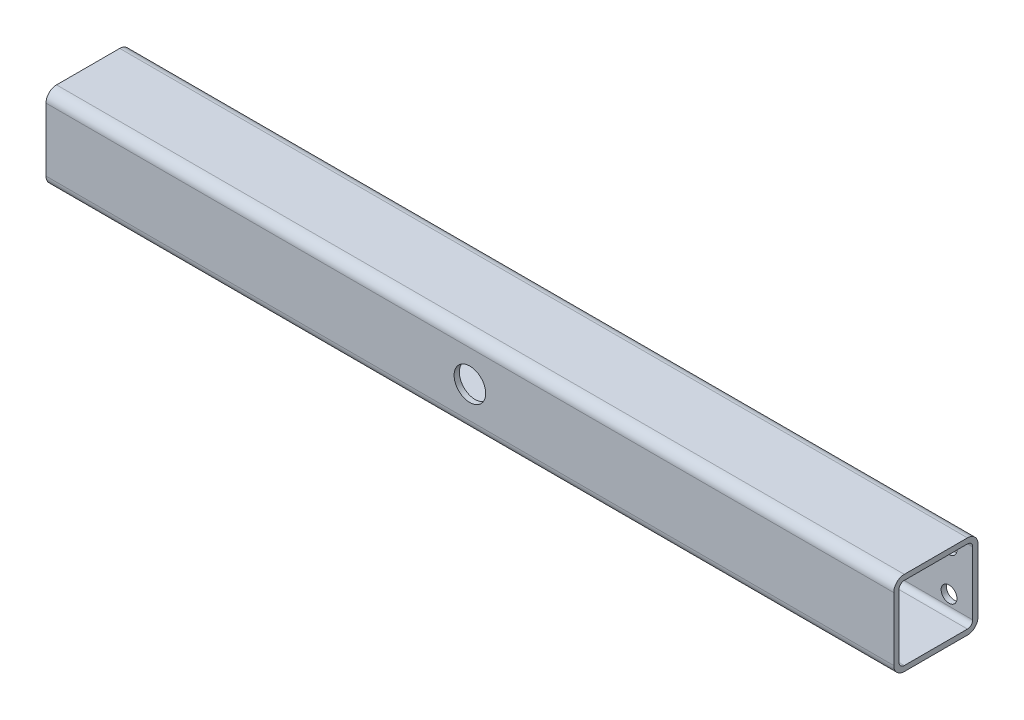
ISO-10303-21;
HEADER;
FILE_DESCRIPTION(('STEP AP214'),'2;1');
FILE_NAME('part.step','',(''),(''),'','','');
FILE_SCHEMA(('AUTOMOTIVE_DESIGN { 1 0 10303 214 1 1 1 1 }'));
ENDSEC;
DATA;
#1=APPLICATION_CONTEXT('core data for automotive mechanical design processes');
#2=APPLICATION_PROTOCOL_DEFINITION('international standard','automotive_design',2000,#1);
#3=PRODUCT_CONTEXT('',#1,'mechanical');
#4=PRODUCT('Part','Part','',(#3));
#5=PRODUCT_RELATED_PRODUCT_CATEGORY('part','',(#4));
#6=PRODUCT_DEFINITION_FORMATION('','',#4);
#7=PRODUCT_DEFINITION_CONTEXT('part definition',#1,'design');
#8=PRODUCT_DEFINITION('design','',#6,#7);
#9=PRODUCT_DEFINITION_SHAPE('','',#8);
#10=(LENGTH_UNIT() NAMED_UNIT(*) SI_UNIT(.MILLI.,.METRE.));
#11=(NAMED_UNIT(*) PLANE_ANGLE_UNIT() SI_UNIT($,.RADIAN.));
#12=(NAMED_UNIT(*) SI_UNIT($,.STERADIAN.) SOLID_ANGLE_UNIT());
#13=UNCERTAINTY_MEASURE_WITH_UNIT(LENGTH_MEASURE(1.E-05),#10,'distance_accuracy_value','');
#14=(GEOMETRIC_REPRESENTATION_CONTEXT(3) GLOBAL_UNCERTAINTY_ASSIGNED_CONTEXT((#13)) GLOBAL_UNIT_ASSIGNED_CONTEXT((#10,
#11,#12)) REPRESENTATION_CONTEXT('',''));
#15=CARTESIAN_POINT('',(0.,0.,0.));
#16=DIRECTION('',(0.,0.,1.));
#17=DIRECTION('',(1.,0.,0.));
#18=AXIS2_PLACEMENT_3D('',#15,#16,#17);
#19=CARTESIAN_POINT('',(511.175,38.1,127.));
#20=DIRECTION('',(0.,1.,0.));
#21=DIRECTION('',(0.,0.,1.));
#22=AXIS2_PLACEMENT_3D('',#19,#20,#21);
#23=PLANE('',#22);
#24=DIRECTION('',(0.,0.,-1.));
#25=VECTOR('',#24,1.);
#26=CARTESIAN_POINT('',(-511.175,38.1,127.));
#27=LINE('',#26,#25);
#28=CARTESIAN_POINT('',(-511.175,38.1,127.));
#29=VERTEX_POINT('',#28);
#30=CARTESIAN_POINT('',(-511.175,38.1,50.8));
#31=VERTEX_POINT('',#30);
#32=EDGE_CURVE('E235',#29,#31,#27,.T.);
#33=ORIENTED_EDGE('',*,*,#32,.T.);
#34=DIRECTION('',(-1.,0.,0.));
#35=VECTOR('',#34,1.);
#36=CARTESIAN_POINT('',(511.175,38.1,50.8));
#37=LINE('',#36,#35);
#38=CARTESIAN_POINT('',(511.175,38.1,50.8));
#39=VERTEX_POINT('',#38);
#40=EDGE_CURVE('E254',#39,#31,#37,.T.);
#41=ORIENTED_EDGE('',*,*,#40,.F.);
#42=DIRECTION('',(0.,0.,-1.));
#43=VECTOR('',#42,1.);
#44=CARTESIAN_POINT('',(511.175,38.1,127.));
#45=LINE('',#44,#43);
#46=CARTESIAN_POINT('',(511.175,38.1,127.));
#47=VERTEX_POINT('',#46);
#48=EDGE_CURVE('E252',#47,#39,#45,.T.);
#49=ORIENTED_EDGE('',*,*,#48,.F.);
#50=DIRECTION('',(-1.,0.,0.));
#51=VECTOR('',#50,1.);
#52=CARTESIAN_POINT('',(511.175,38.1,127.));
#53=LINE('',#52,#51);
#54=EDGE_CURVE('E257',#47,#29,#53,.T.);
#55=ORIENTED_EDGE('',*,*,#54,.T.);
#56=EDGE_LOOP('',(#33,#41,#49,#55));
#57=FACE_BOUND('',#56,.T.);
#58=CARTESIAN_POINT('',(482.6,38.1,120.65));
#59=DIRECTION('',(0.,-1.,0.));
#60=DIRECTION('',(0.,0.,-1.));
#61=AXIS2_PLACEMENT_3D('',#58,#59,#60);
#62=CIRCLE('',#61,3.97510000000003);
#63=CARTESIAN_POINT('',(482.6,38.1,116.6749));
#64=VERTEX_POINT('',#63);
#65=EDGE_CURVE('E285',#64,#64,#62,.T.);
#66=ORIENTED_EDGE('',*,*,#65,.F.);
#67=EDGE_LOOP('',(#66));
#68=FACE_BOUND('',#67,.T.);
#69=CARTESIAN_POINT('',(-482.6,38.1,120.65));
#70=DIRECTION('',(0.,1.,0.));
#71=DIRECTION('',(0.,0.,-1.));
#72=AXIS2_PLACEMENT_3D('',#69,#70,#71);
#73=CIRCLE('',#72,3.97510000000003);
#74=CARTESIAN_POINT('',(-482.6,38.1,116.6749));
#75=VERTEX_POINT('',#74);
#76=EDGE_CURVE('E301',#75,#75,#73,.T.);
#77=ORIENTED_EDGE('',*,*,#76,.T.);
#78=EDGE_LOOP('',(#77));
#79=FACE_BOUND('',#78,.T.);
#80=ADVANCED_FACE('F36',(#57,#68,#79),#23,.F.);
#81=CARTESIAN_POINT('',(511.175,44.45,127.));
#82=DIRECTION('',(0.,1.,0.));
#83=DIRECTION('',(0.,0.,1.));
#84=AXIS2_PLACEMENT_3D('',#81,#82,#83);
#85=PLANE('',#84);
#86=DIRECTION('',(0.,0.,-1.));
#87=VECTOR('',#86,1.);
#88=CARTESIAN_POINT('',(-511.175,44.45,127.));
#89=LINE('',#88,#87);
#90=CARTESIAN_POINT('',(-511.175,44.45,127.));
#91=VERTEX_POINT('',#90);
#92=CARTESIAN_POINT('',(-511.175,44.45,50.8));
#93=VERTEX_POINT('',#92);
#94=EDGE_CURVE('E182',#91,#93,#89,.T.);
#95=ORIENTED_EDGE('',*,*,#94,.F.);
#96=DIRECTION('',(-1.,0.,0.));
#97=VECTOR('',#96,1.);
#98=CARTESIAN_POINT('',(511.175,44.45,127.));
#99=LINE('',#98,#97);
#100=CARTESIAN_POINT('',(511.175,44.45,127.));
#101=VERTEX_POINT('',#100);
#102=EDGE_CURVE('E218',#101,#91,#99,.T.);
#103=ORIENTED_EDGE('',*,*,#102,.F.);
#104=DIRECTION('',(0.,0.,-1.));
#105=VECTOR('',#104,1.);
#106=CARTESIAN_POINT('',(511.175,44.45,127.));
#107=LINE('',#106,#105);
#108=CARTESIAN_POINT('',(511.175,44.45,50.8));
#109=VERTEX_POINT('',#108);
#110=EDGE_CURVE('E199',#101,#109,#107,.T.);
#111=ORIENTED_EDGE('',*,*,#110,.T.);
#112=DIRECTION('',(-1.,0.,0.));
#113=VECTOR('',#112,1.);
#114=CARTESIAN_POINT('',(511.175,44.45,50.8));
#115=LINE('',#114,#113);
#116=EDGE_CURVE('E216',#109,#93,#115,.T.);
#117=ORIENTED_EDGE('',*,*,#116,.T.);
#118=EDGE_LOOP('',(#95,#103,#111,#117));
#119=FACE_BOUND('',#118,.T.);
#120=CARTESIAN_POINT('',(482.6,44.45,120.65));
#121=DIRECTION('',(0.,1.,0.));
#122=DIRECTION('',(0.,0.,1.));
#123=AXIS2_PLACEMENT_3D('',#120,#121,#122);
#124=CIRCLE('',#123,3.97510000000003);
#125=CARTESIAN_POINT('',(482.6,44.45,124.6251));
#126=VERTEX_POINT('',#125);
#127=EDGE_CURVE('E282',#126,#126,#124,.T.);
#128=ORIENTED_EDGE('',*,*,#127,.F.);
#129=EDGE_LOOP('',(#128));
#130=FACE_BOUND('',#129,.T.);
#131=CARTESIAN_POINT('',(-482.6,44.45,120.65));
#132=DIRECTION('',(0.,1.,0.));
#133=DIRECTION('',(0.,0.,1.));
#134=AXIS2_PLACEMENT_3D('',#131,#132,#133);
#135=CIRCLE('',#134,3.97510000000003);
#136=CARTESIAN_POINT('',(-482.6,44.45,124.6251));
#137=VERTEX_POINT('',#136);
#138=EDGE_CURVE('E40',#137,#137,#135,.F.);
#139=ORIENTED_EDGE('',*,*,#138,.T.);
#140=EDGE_LOOP('',(#139));
#141=FACE_BOUND('',#140,.T.);
#142=ADVANCED_FACE('F316',(#119,#130,#141),#85,.T.);
#143=CARTESIAN_POINT('',(511.175,127.,38.1));
#144=DIRECTION('',(0.,0.,1.));
#145=DIRECTION('',(0.,-1.,0.));
#146=AXIS2_PLACEMENT_3D('',#143,#144,#145);
#147=PLANE('',#146);
#148=CARTESIAN_POINT('',(-482.6,63.5,38.1));
#149=DIRECTION('',(0.,0.,1.));
#150=DIRECTION('',(0.,1.,0.));
#151=AXIS2_PLACEMENT_3D('',#148,#149,#150);
#152=CIRCLE('',#151,9.52500000000002);
#153=CARTESIAN_POINT('',(-482.6,73.025,38.1));
#154=VERTEX_POINT('',#153);
#155=EDGE_CURVE('E288',#154,#154,#152,.T.);
#156=ORIENTED_EDGE('',*,*,#155,.T.);
#157=EDGE_LOOP('',(#156));
#158=FACE_BOUND('',#157,.T.);
#159=CARTESIAN_POINT('',(482.6,114.3,38.1));
#160=DIRECTION('',(0.,0.,-1.));
#161=DIRECTION('',(0.,1.,0.));
#162=AXIS2_PLACEMENT_3D('',#159,#160,#161);
#163=CIRCLE('',#162,9.52500000000002);
#164=CARTESIAN_POINT('',(482.6,123.825,38.1));
#165=VERTEX_POINT('',#164);
#166=EDGE_CURVE('E281',#165,#165,#163,.T.);
#167=ORIENTED_EDGE('',*,*,#166,.F.);
#168=EDGE_LOOP('',(#167));
#169=FACE_BOUND('',#168,.T.);
#170=CARTESIAN_POINT('',(482.6,63.5,38.1));
#171=DIRECTION('',(0.,0.,-1.));
#172=DIRECTION('',(0.,1.,0.));
#173=AXIS2_PLACEMENT_3D('',#170,#171,#172);
#174=CIRCLE('',#173,9.52500000000002);
#175=CARTESIAN_POINT('',(482.6,73.025,38.1));
#176=VERTEX_POINT('',#175);
#177=EDGE_CURVE('E277',#176,#176,#174,.T.);
#178=ORIENTED_EDGE('',*,*,#177,.F.);
#179=EDGE_LOOP('',(#178));
#180=FACE_BOUND('',#179,.T.);
#181=DIRECTION('',(0.,1.,0.));
#182=VECTOR('',#181,1.);
#183=CARTESIAN_POINT('',(-511.175,127.,38.1));
#184=LINE('',#183,#182);
#185=CARTESIAN_POINT('',(-511.175,50.8,38.1));
#186=VERTEX_POINT('',#185);
#187=CARTESIAN_POINT('',(-511.175,127.,38.1));
#188=VERTEX_POINT('',#187);
#189=EDGE_CURVE('E223',#186,#188,#184,.T.);
#190=ORIENTED_EDGE('',*,*,#189,.T.);
#191=DIRECTION('',(-1.,0.,0.));
#192=VECTOR('',#191,1.);
#193=CARTESIAN_POINT('',(511.175,127.,38.1));
#194=LINE('',#193,#192);
#195=CARTESIAN_POINT('',(511.175,127.,38.1));
#196=VERTEX_POINT('',#195);
#197=EDGE_CURVE('E45',#196,#188,#194,.T.);
#198=ORIENTED_EDGE('',*,*,#197,.F.);
#199=DIRECTION('',(0.,1.,0.));
#200=VECTOR('',#199,1.);
#201=CARTESIAN_POINT('',(511.175,127.,38.1));
#202=LINE('',#201,#200);
#203=CARTESIAN_POINT('',(511.175,50.8,38.1));
#204=VERTEX_POINT('',#203);
#205=EDGE_CURVE('E240',#204,#196,#202,.T.);
#206=ORIENTED_EDGE('',*,*,#205,.F.);
#207=DIRECTION('',(-1.,0.,0.));
#208=VECTOR('',#207,1.);
#209=CARTESIAN_POINT('',(511.175,50.8,38.1));
#210=LINE('',#209,#208);
#211=EDGE_CURVE('E11',#204,#186,#210,.T.);
#212=ORIENTED_EDGE('',*,*,#211,.T.);
#213=EDGE_LOOP('',(#190,#198,#206,#212));
#214=FACE_BOUND('',#213,.T.);
#215=CARTESIAN_POINT('',(-482.6,114.3,38.1));
#216=DIRECTION('',(0.,0.,1.));
#217=DIRECTION('',(0.,1.,0.));
#218=AXIS2_PLACEMENT_3D('',#215,#216,#217);
#219=CIRCLE('',#218,9.52500000000002);
#220=CARTESIAN_POINT('',(-482.6,123.825,38.1));
#221=VERTEX_POINT('',#220);
#222=EDGE_CURVE('E291',#221,#221,#219,.T.);
#223=ORIENTED_EDGE('',*,*,#222,.T.);
#224=EDGE_LOOP('',(#223));
#225=FACE_BOUND('',#224,.T.);
#226=ADVANCED_FACE('F312',(#158,#169,#180,#214,#225),#147,.F.);
#227=CARTESIAN_POINT('',(511.175,127.,44.45));
#228=DIRECTION('',(0.,0.,1.));
#229=DIRECTION('',(0.,-1.,0.));
#230=AXIS2_PLACEMENT_3D('',#227,#228,#229);
#231=PLANE('',#230);
#232=CARTESIAN_POINT('',(-482.6,63.5,44.45));
#233=DIRECTION('',(0.,0.,1.));
#234=DIRECTION('',(0.,-1.,0.));
#235=AXIS2_PLACEMENT_3D('',#232,#233,#234);
#236=CIRCLE('',#235,9.52500000000002);
#237=CARTESIAN_POINT('',(-482.6,53.975,44.45));
#238=VERTEX_POINT('',#237);
#239=EDGE_CURVE('E286',#238,#238,#236,.F.);
#240=ORIENTED_EDGE('',*,*,#239,.T.);
#241=EDGE_LOOP('',(#240));
#242=FACE_BOUND('',#241,.T.);
#243=CARTESIAN_POINT('',(482.6,114.3,44.45));
#244=DIRECTION('',(0.,0.,1.));
#245=DIRECTION('',(0.,-1.,0.));
#246=AXIS2_PLACEMENT_3D('',#243,#244,#245);
#247=CIRCLE('',#246,9.52500000000002);
#248=CARTESIAN_POINT('',(482.6,104.775,44.45));
#249=VERTEX_POINT('',#248);
#250=EDGE_CURVE('E278',#249,#249,#247,.T.);
#251=ORIENTED_EDGE('',*,*,#250,.F.);
#252=EDGE_LOOP('',(#251));
#253=FACE_BOUND('',#252,.T.);
#254=CARTESIAN_POINT('',(482.6,63.5,44.45));
#255=DIRECTION('',(0.,0.,1.));
#256=DIRECTION('',(0.,-1.,0.));
#257=AXIS2_PLACEMENT_3D('',#254,#255,#256);
#258=CIRCLE('',#257,9.52500000000002);
#259=CARTESIAN_POINT('',(482.6,53.975,44.45));
#260=VERTEX_POINT('',#259);
#261=EDGE_CURVE('E274',#260,#260,#258,.T.);
#262=ORIENTED_EDGE('',*,*,#261,.F.);
#263=EDGE_LOOP('',(#262));
#264=FACE_BOUND('',#263,.T.);
#265=DIRECTION('',(0.,1.,0.));
#266=VECTOR('',#265,1.);
#267=CARTESIAN_POINT('',(-511.175,127.,44.45));
#268=LINE('',#267,#266);
#269=CARTESIAN_POINT('',(-511.175,50.8,44.45));
#270=VERTEX_POINT('',#269);
#271=CARTESIAN_POINT('',(-511.175,127.,44.45));
#272=VERTEX_POINT('',#271);
#273=EDGE_CURVE('E188',#270,#272,#268,.T.);
#274=ORIENTED_EDGE('',*,*,#273,.F.);
#275=DIRECTION('',(-1.,0.,0.));
#276=VECTOR('',#275,1.);
#277=CARTESIAN_POINT('',(511.175,50.8,44.45));
#278=LINE('',#277,#276);
#279=CARTESIAN_POINT('',(511.175,50.8,44.45));
#280=VERTEX_POINT('',#279);
#281=EDGE_CURVE('E214',#280,#270,#278,.T.);
#282=ORIENTED_EDGE('',*,*,#281,.F.);
#283=DIRECTION('',(0.,1.,0.));
#284=VECTOR('',#283,1.);
#285=CARTESIAN_POINT('',(511.175,127.,44.45));
#286=LINE('',#285,#284);
#287=CARTESIAN_POINT('',(511.175,127.,44.45));
#288=VERTEX_POINT('',#287);
#289=EDGE_CURVE('E203',#280,#288,#286,.T.);
#290=ORIENTED_EDGE('',*,*,#289,.T.);
#291=DIRECTION('',(-1.,0.,0.));
#292=VECTOR('',#291,1.);
#293=CARTESIAN_POINT('',(511.175,127.,44.45));
#294=LINE('',#293,#292);
#295=EDGE_CURVE('E212',#288,#272,#294,.T.);
#296=ORIENTED_EDGE('',*,*,#295,.T.);
#297=EDGE_LOOP('',(#274,#282,#290,#296));
#298=FACE_BOUND('',#297,.T.);
#299=CARTESIAN_POINT('',(-482.6,114.3,44.45));
#300=DIRECTION('',(0.,0.,1.));
#301=DIRECTION('',(0.,-1.,0.));
#302=AXIS2_PLACEMENT_3D('',#299,#300,#301);
#303=CIRCLE('',#302,9.52500000000002);
#304=CARTESIAN_POINT('',(-482.6,104.775,44.45));
#305=VERTEX_POINT('',#304);
#306=EDGE_CURVE('E289',#305,#305,#303,.F.);
#307=ORIENTED_EDGE('',*,*,#306,.T.);
#308=EDGE_LOOP('',(#307));
#309=FACE_BOUND('',#308,.T.);
#310=ADVANCED_FACE('F315',(#242,#253,#264,#298,#309),#231,.T.);
#311=CARTESIAN_POINT('',(511.175,50.8,50.8));
#312=DIRECTION('',(-1.,0.,0.));
#313=DIRECTION('',(0.,0.,1.));
#314=AXIS2_PLACEMENT_3D('',#311,#312,#313);
#315=PLANE('',#314);
#316=CARTESIAN_POINT('',(511.175,50.8,50.8));
#317=DIRECTION('',(1.,0.,0.));
#318=DIRECTION('',(0.,0.,1.));
#319=AXIS2_PLACEMENT_3D('',#316,#317,#318);
#320=CIRCLE('',#319,12.7);
#321=EDGE_CURVE('E237',#39,#204,#320,.T.);
#322=ORIENTED_EDGE('',*,*,#321,.T.);
#323=ORIENTED_EDGE('',*,*,#205,.T.);
#324=CARTESIAN_POINT('',(511.175,127.,50.8));
#325=DIRECTION('',(1.,0.,0.));
#326=DIRECTION('',(0.,0.,-1.));
#327=AXIS2_PLACEMENT_3D('',#324,#325,#326);
#328=CIRCLE('',#327,12.7);
#329=CARTESIAN_POINT('',(511.175,139.7,50.8));
#330=VERTEX_POINT('',#329);
#331=EDGE_CURVE('E242',#196,#330,#328,.T.);
#332=ORIENTED_EDGE('',*,*,#331,.T.);
#333=DIRECTION('',(0.,0.,1.));
#334=VECTOR('',#333,1.);
#335=CARTESIAN_POINT('',(511.175,139.7,127.));
#336=LINE('',#335,#334);
#337=CARTESIAN_POINT('',(511.175,139.7,127.));
#338=VERTEX_POINT('',#337);
#339=EDGE_CURVE('E244',#330,#338,#336,.T.);
#340=ORIENTED_EDGE('',*,*,#339,.T.);
#341=CARTESIAN_POINT('',(511.175,127.,127.));
#342=DIRECTION('',(1.,0.,0.));
#343=DIRECTION('',(0.,0.,1.));
#344=AXIS2_PLACEMENT_3D('',#341,#342,#343);
#345=CIRCLE('',#344,12.7);
#346=CARTESIAN_POINT('',(511.175,127.,139.7));
#347=VERTEX_POINT('',#346);
#348=EDGE_CURVE('E246',#338,#347,#345,.T.);
#349=ORIENTED_EDGE('',*,*,#348,.T.);
#350=DIRECTION('',(0.,-1.,0.));
#351=VECTOR('',#350,1.);
#352=CARTESIAN_POINT('',(511.175,127.,139.7));
#353=LINE('',#352,#351);
#354=CARTESIAN_POINT('',(511.175,50.8,139.7));
#355=VERTEX_POINT('',#354);
#356=EDGE_CURVE('E248',#347,#355,#353,.T.);
#357=ORIENTED_EDGE('',*,*,#356,.T.);
#358=CARTESIAN_POINT('',(511.175,50.8,127.));
#359=DIRECTION('',(1.,0.,0.));
#360=DIRECTION('',(0.,0.,1.));
#361=AXIS2_PLACEMENT_3D('',#358,#359,#360);
#362=CIRCLE('',#361,12.7);
#363=EDGE_CURVE('E250',#355,#47,#362,.T.);
#364=ORIENTED_EDGE('',*,*,#363,.T.);
#365=ORIENTED_EDGE('',*,*,#48,.T.);
#366=EDGE_LOOP('',(#322,#323,#332,#340,#349,#357,#364,#365));
#367=FACE_BOUND('',#366,.T.);
#368=CARTESIAN_POINT('',(511.175,127.,127.));
#369=DIRECTION('',(1.,0.,0.));
#370=DIRECTION('',(0.,0.,1.));
#371=AXIS2_PLACEMENT_3D('',#368,#369,#370);
#372=CIRCLE('',#371,6.34999999999997);
#373=CARTESIAN_POINT('',(511.175,133.35,127.));
#374=VERTEX_POINT('',#373);
#375=CARTESIAN_POINT('',(511.175,127.,133.35));
#376=VERTEX_POINT('',#375);
#377=EDGE_CURVE('E166',#374,#376,#372,.T.);
#378=ORIENTED_EDGE('',*,*,#377,.F.);
#379=DIRECTION('',(0.,0.,1.));
#380=VECTOR('',#379,1.);
#381=CARTESIAN_POINT('',(511.175,133.35,127.));
#382=LINE('',#381,#380);
#383=CARTESIAN_POINT('',(511.175,133.35,50.8));
#384=VERTEX_POINT('',#383);
#385=EDGE_CURVE('E207',#384,#374,#382,.T.);
#386=ORIENTED_EDGE('',*,*,#385,.F.);
#387=CARTESIAN_POINT('',(511.175,127.,50.8));
#388=DIRECTION('',(1.,0.,0.));
#389=DIRECTION('',(0.,0.,-1.));
#390=AXIS2_PLACEMENT_3D('',#387,#388,#389);
#391=CIRCLE('',#390,6.34999999999996);
#392=EDGE_CURVE('E205',#288,#384,#391,.T.);
#393=ORIENTED_EDGE('',*,*,#392,.F.);
#394=ORIENTED_EDGE('',*,*,#289,.F.);
#395=CARTESIAN_POINT('',(511.175,50.8,50.8));
#396=DIRECTION('',(1.,0.,0.));
#397=DIRECTION('',(0.,0.,1.));
#398=AXIS2_PLACEMENT_3D('',#395,#396,#397);
#399=CIRCLE('',#398,6.35);
#400=EDGE_CURVE('E201',#109,#280,#399,.T.);
#401=ORIENTED_EDGE('',*,*,#400,.F.);
#402=ORIENTED_EDGE('',*,*,#110,.F.);
#403=CARTESIAN_POINT('',(511.175,50.8,127.));
#404=DIRECTION('',(1.,0.,0.));
#405=DIRECTION('',(0.,0.,1.));
#406=AXIS2_PLACEMENT_3D('',#403,#404,#405);
#407=CIRCLE('',#406,6.35);
#408=CARTESIAN_POINT('',(511.175,50.8,133.35));
#409=VERTEX_POINT('',#408);
#410=EDGE_CURVE('E197',#409,#101,#407,.T.);
#411=ORIENTED_EDGE('',*,*,#410,.F.);
#412=DIRECTION('',(0.,-1.,0.));
#413=VECTOR('',#412,1.);
#414=CARTESIAN_POINT('',(511.175,127.,133.35));
#415=LINE('',#414,#413);
#416=EDGE_CURVE('E195',#376,#409,#415,.T.);
#417=ORIENTED_EDGE('',*,*,#416,.F.);
#418=EDGE_LOOP('',(#378,#386,#393,#394,#401,#402,#411,#417));
#419=FACE_BOUND('',#418,.T.);
#420=ADVANCED_FACE('F340',(#367,#419),#315,.F.);
#421=CARTESIAN_POINT('',(-511.175,50.8,50.8));
#422=DIRECTION('',(-1.,0.,0.));
#423=DIRECTION('',(0.,0.,1.));
#424=AXIS2_PLACEMENT_3D('',#421,#422,#423);
#425=PLANE('',#424);
#426=CARTESIAN_POINT('',(-511.175,50.8,50.8));
#427=DIRECTION('',(1.,0.,0.));
#428=DIRECTION('',(0.,0.,1.));
#429=AXIS2_PLACEMENT_3D('',#426,#427,#428);
#430=CIRCLE('',#429,12.7);
#431=EDGE_CURVE('E167',#31,#186,#430,.T.);
#432=ORIENTED_EDGE('',*,*,#431,.F.);
#433=ORIENTED_EDGE('',*,*,#32,.F.);
#434=CARTESIAN_POINT('',(-511.175,50.8,127.));
#435=DIRECTION('',(1.,0.,0.));
#436=DIRECTION('',(0.,0.,1.));
#437=AXIS2_PLACEMENT_3D('',#434,#435,#436);
#438=CIRCLE('',#437,12.7);
#439=CARTESIAN_POINT('',(-511.175,50.8,139.7));
#440=VERTEX_POINT('',#439);
#441=EDGE_CURVE('E233',#440,#29,#438,.T.);
#442=ORIENTED_EDGE('',*,*,#441,.F.);
#443=DIRECTION('',(0.,-1.,0.));
#444=VECTOR('',#443,1.);
#445=CARTESIAN_POINT('',(-511.175,127.,139.7));
#446=LINE('',#445,#444);
#447=CARTESIAN_POINT('',(-511.175,127.,139.7));
#448=VERTEX_POINT('',#447);
#449=EDGE_CURVE('E231',#448,#440,#446,.T.);
#450=ORIENTED_EDGE('',*,*,#449,.F.);
#451=CARTESIAN_POINT('',(-511.175,127.,127.));
#452=DIRECTION('',(1.,0.,0.));
#453=DIRECTION('',(0.,0.,1.));
#454=AXIS2_PLACEMENT_3D('',#451,#452,#453);
#455=CIRCLE('',#454,12.7);
#456=CARTESIAN_POINT('',(-511.175,139.7,127.));
#457=VERTEX_POINT('',#456);
#458=EDGE_CURVE('E229',#457,#448,#455,.T.);
#459=ORIENTED_EDGE('',*,*,#458,.F.);
#460=DIRECTION('',(0.,0.,1.));
#461=VECTOR('',#460,1.);
#462=CARTESIAN_POINT('',(-511.175,139.7,127.));
#463=LINE('',#462,#461);
#464=CARTESIAN_POINT('',(-511.175,139.7,50.8));
#465=VERTEX_POINT('',#464);
#466=EDGE_CURVE('E227',#465,#457,#463,.T.);
#467=ORIENTED_EDGE('',*,*,#466,.F.);
#468=CARTESIAN_POINT('',(-511.175,127.,50.8));
#469=DIRECTION('',(1.,0.,0.));
#470=DIRECTION('',(0.,0.,-1.));
#471=AXIS2_PLACEMENT_3D('',#468,#469,#470);
#472=CIRCLE('',#471,12.7);
#473=EDGE_CURVE('E225',#188,#465,#472,.T.);
#474=ORIENTED_EDGE('',*,*,#473,.F.);
#475=ORIENTED_EDGE('',*,*,#189,.F.);
#476=EDGE_LOOP('',(#432,#433,#442,#450,#459,#467,#474,#475));
#477=FACE_BOUND('',#476,.T.);
#478=DIRECTION('',(0.,0.,1.));
#479=VECTOR('',#478,1.);
#480=CARTESIAN_POINT('',(-511.175,133.35,127.));
#481=LINE('',#480,#479);
#482=CARTESIAN_POINT('',(-511.175,133.35,50.8));
#483=VERTEX_POINT('',#482);
#484=CARTESIAN_POINT('',(-511.175,133.35,127.));
#485=VERTEX_POINT('',#484);
#486=EDGE_CURVE('E172',#483,#485,#481,.T.);
#487=ORIENTED_EDGE('',*,*,#486,.T.);
#488=CARTESIAN_POINT('',(-511.175,127.,127.));
#489=DIRECTION('',(1.,0.,0.));
#490=DIRECTION('',(0.,0.,1.));
#491=AXIS2_PLACEMENT_3D('',#488,#489,#490);
#492=CIRCLE('',#491,6.34999999999997);
#493=CARTESIAN_POINT('',(-511.175,127.,133.35));
#494=VERTEX_POINT('',#493);
#495=EDGE_CURVE('E61',#485,#494,#492,.T.);
#496=ORIENTED_EDGE('',*,*,#495,.T.);
#497=DIRECTION('',(0.,-1.,0.));
#498=VECTOR('',#497,1.);
#499=CARTESIAN_POINT('',(-511.175,127.,133.35));
#500=LINE('',#499,#498);
#501=CARTESIAN_POINT('',(-511.175,50.8,133.35));
#502=VERTEX_POINT('',#501);
#503=EDGE_CURVE('E153',#494,#502,#500,.T.);
#504=ORIENTED_EDGE('',*,*,#503,.T.);
#505=CARTESIAN_POINT('',(-511.175,50.8,127.));
#506=DIRECTION('',(1.,0.,0.));
#507=DIRECTION('',(0.,0.,1.));
#508=AXIS2_PLACEMENT_3D('',#505,#506,#507);
#509=CIRCLE('',#508,6.35);
#510=EDGE_CURVE('E162',#502,#91,#509,.T.);
#511=ORIENTED_EDGE('',*,*,#510,.T.);
#512=ORIENTED_EDGE('',*,*,#94,.T.);
#513=CARTESIAN_POINT('',(-511.175,50.8,50.8));
#514=DIRECTION('',(1.,0.,0.));
#515=DIRECTION('',(0.,0.,1.));
#516=AXIS2_PLACEMENT_3D('',#513,#514,#515);
#517=CIRCLE('',#516,6.35);
#518=EDGE_CURVE('E185',#93,#270,#517,.T.);
#519=ORIENTED_EDGE('',*,*,#518,.T.);
#520=ORIENTED_EDGE('',*,*,#273,.T.);
#521=CARTESIAN_POINT('',(-511.175,127.,50.8));
#522=DIRECTION('',(1.,0.,0.));
#523=DIRECTION('',(0.,0.,-1.));
#524=AXIS2_PLACEMENT_3D('',#521,#522,#523);
#525=CIRCLE('',#524,6.34999999999996);
#526=EDGE_CURVE('E191',#272,#483,#525,.T.);
#527=ORIENTED_EDGE('',*,*,#526,.T.);
#528=EDGE_LOOP('',(#487,#496,#504,#511,#512,#519,#520,#527));
#529=FACE_BOUND('',#528,.T.);
#530=ADVANCED_FACE('F170',(#477,#529),#425,.T.);
#531=CARTESIAN_POINT('',(511.175,50.8,50.8));
#532=DIRECTION('',(-1.,0.,0.));
#533=DIRECTION('',(0.,0.,1.));
#534=AXIS2_PLACEMENT_3D('',#531,#532,#533);
#535=CYLINDRICAL_SURFACE('',#534,12.7);
#536=ORIENTED_EDGE('',*,*,#431,.T.);
#537=ORIENTED_EDGE('',*,*,#211,.F.);
#538=ORIENTED_EDGE('',*,*,#321,.F.);
#539=ORIENTED_EDGE('',*,*,#40,.T.);
#540=EDGE_LOOP('',(#536,#537,#538,#539));
#541=FACE_BOUND('',#540,.T.);
#542=ADVANCED_FACE('F38',(#541),#535,.T.);
#543=CARTESIAN_POINT('',(511.175,127.,50.8));
#544=DIRECTION('',(-1.,0.,0.));
#545=DIRECTION('',(0.,0.,1.));
#546=AXIS2_PLACEMENT_3D('',#543,#544,#545);
#547=CYLINDRICAL_SURFACE('',#546,12.7);
#548=ORIENTED_EDGE('',*,*,#473,.T.);
#549=DIRECTION('',(-1.,0.,0.));
#550=VECTOR('',#549,1.);
#551=CARTESIAN_POINT('',(511.175,139.7,50.8));
#552=LINE('',#551,#550);
#553=EDGE_CURVE('E269',#330,#465,#552,.T.);
#554=ORIENTED_EDGE('',*,*,#553,.F.);
#555=ORIENTED_EDGE('',*,*,#331,.F.);
#556=ORIENTED_EDGE('',*,*,#197,.T.);
#557=EDGE_LOOP('',(#548,#554,#555,#556));
#558=FACE_BOUND('',#557,.T.);
#559=ADVANCED_FACE('F325',(#558),#547,.T.);
#560=CARTESIAN_POINT('',(511.175,139.7,127.));
#561=DIRECTION('',(0.,-1.,0.));
#562=DIRECTION('',(0.,0.,-1.));
#563=AXIS2_PLACEMENT_3D('',#560,#561,#562);
#564=PLANE('',#563);
#565=ORIENTED_EDGE('',*,*,#466,.T.);
#566=DIRECTION('',(-1.,0.,0.));
#567=VECTOR('',#566,1.);
#568=CARTESIAN_POINT('',(511.175,139.7,127.));
#569=LINE('',#568,#567);
#570=EDGE_CURVE('E266',#338,#457,#569,.T.);
#571=ORIENTED_EDGE('',*,*,#570,.F.);
#572=ORIENTED_EDGE('',*,*,#339,.F.);
#573=ORIENTED_EDGE('',*,*,#553,.T.);
#574=EDGE_LOOP('',(#565,#571,#572,#573));
#575=FACE_BOUND('',#574,.T.);
#576=ADVANCED_FACE('F332',(#575),#564,.F.);
#577=CARTESIAN_POINT('',(511.175,127.,127.));
#578=DIRECTION('',(-1.,0.,0.));
#579=DIRECTION('',(0.,0.,1.));
#580=AXIS2_PLACEMENT_3D('',#577,#578,#579);
#581=CYLINDRICAL_SURFACE('',#580,12.7);
#582=ORIENTED_EDGE('',*,*,#458,.T.);
#583=DIRECTION('',(-1.,0.,0.));
#584=VECTOR('',#583,1.);
#585=CARTESIAN_POINT('',(511.175,127.,139.7));
#586=LINE('',#585,#584);
#587=EDGE_CURVE('E263',#347,#448,#586,.T.);
#588=ORIENTED_EDGE('',*,*,#587,.F.);
#589=ORIENTED_EDGE('',*,*,#348,.F.);
#590=ORIENTED_EDGE('',*,*,#570,.T.);
#591=EDGE_LOOP('',(#582,#588,#589,#590));
#592=FACE_BOUND('',#591,.T.);
#593=ADVANCED_FACE('F336',(#592),#581,.T.);
#594=CARTESIAN_POINT('',(511.175,127.,139.7));
#595=DIRECTION('',(0.,0.,-1.));
#596=DIRECTION('',(0.,1.,0.));
#597=AXIS2_PLACEMENT_3D('',#594,#595,#596);
#598=PLANE('',#597);
#599=CARTESIAN_POINT('',(0.,88.9,139.7));
#600=DIRECTION('',(0.,0.,1.));
#601=DIRECTION('',(1.,0.,0.));
#602=AXIS2_PLACEMENT_3D('',#599,#600,#601);
#603=CIRCLE('',#602,19.05);
#604=CARTESIAN_POINT('',(19.05,88.9,139.7));
#605=VERTEX_POINT('',#604);
#606=EDGE_CURVE('E176',#605,#605,#603,.T.);
#607=ORIENTED_EDGE('',*,*,#606,.F.);
#608=EDGE_LOOP('',(#607));
#609=FACE_BOUND('',#608,.T.);
#610=ORIENTED_EDGE('',*,*,#449,.T.);
#611=DIRECTION('',(-1.,0.,0.));
#612=VECTOR('',#611,1.);
#613=CARTESIAN_POINT('',(511.175,50.8,139.7));
#614=LINE('',#613,#612);
#615=EDGE_CURVE('E260',#355,#440,#614,.T.);
#616=ORIENTED_EDGE('',*,*,#615,.F.);
#617=ORIENTED_EDGE('',*,*,#356,.F.);
#618=ORIENTED_EDGE('',*,*,#587,.T.);
#619=EDGE_LOOP('',(#610,#616,#617,#618));
#620=FACE_BOUND('',#619,.T.);
#621=ADVANCED_FACE('F356',(#609,#620),#598,.F.);
#622=CARTESIAN_POINT('',(511.175,50.8,127.));
#623=DIRECTION('',(-1.,0.,0.));
#624=DIRECTION('',(0.,0.,1.));
#625=AXIS2_PLACEMENT_3D('',#622,#623,#624);
#626=CYLINDRICAL_SURFACE('',#625,12.7);
#627=ORIENTED_EDGE('',*,*,#441,.T.);
#628=ORIENTED_EDGE('',*,*,#54,.F.);
#629=ORIENTED_EDGE('',*,*,#363,.F.);
#630=ORIENTED_EDGE('',*,*,#615,.T.);
#631=EDGE_LOOP('',(#627,#628,#629,#630));
#632=FACE_BOUND('',#631,.T.);
#633=ADVANCED_FACE('F354',(#632),#626,.T.);
#634=CARTESIAN_POINT('',(511.175,127.,127.));
#635=DIRECTION('',(-1.,0.,0.));
#636=DIRECTION('',(0.,0.,1.));
#637=AXIS2_PLACEMENT_3D('',#634,#635,#636);
#638=CYLINDRICAL_SURFACE('',#637,6.34999999999997);
#639=ORIENTED_EDGE('',*,*,#495,.F.);
#640=DIRECTION('',(-1.,0.,0.));
#641=VECTOR('',#640,1.);
#642=CARTESIAN_POINT('',(511.175,133.35,127.));
#643=LINE('',#642,#641);
#644=EDGE_CURVE('E209',#374,#485,#643,.T.);
#645=ORIENTED_EDGE('',*,*,#644,.F.);
#646=ORIENTED_EDGE('',*,*,#377,.T.);
#647=DIRECTION('',(-1.,0.,0.));
#648=VECTOR('',#647,1.);
#649=CARTESIAN_POINT('',(511.175,127.,133.35));
#650=LINE('',#649,#648);
#651=EDGE_CURVE('E155',#376,#494,#650,.T.);
#652=ORIENTED_EDGE('',*,*,#651,.T.);
#653=EDGE_LOOP('',(#639,#645,#646,#652));
#654=FACE_BOUND('',#653,.T.);
#655=ADVANCED_FACE('F164',(#654),#638,.F.);
#656=CARTESIAN_POINT('',(511.175,127.,133.35));
#657=DIRECTION('',(0.,0.,-1.));
#658=DIRECTION('',(0.,1.,0.));
#659=AXIS2_PLACEMENT_3D('',#656,#657,#658);
#660=PLANE('',#659);
#661=CARTESIAN_POINT('',(0.,88.9,133.35));
#662=DIRECTION('',(0.,0.,-1.));
#663=DIRECTION('',(0.,1.,0.));
#664=AXIS2_PLACEMENT_3D('',#661,#662,#663);
#665=CIRCLE('',#664,19.05);
#666=CARTESIAN_POINT('',(0.,107.95,133.35));
#667=VERTEX_POINT('',#666);
#668=EDGE_CURVE('E173',#667,#667,#665,.T.);
#669=ORIENTED_EDGE('',*,*,#668,.F.);
#670=EDGE_LOOP('',(#669));
#671=FACE_BOUND('',#670,.T.);
#672=ORIENTED_EDGE('',*,*,#503,.F.);
#673=ORIENTED_EDGE('',*,*,#651,.F.);
#674=ORIENTED_EDGE('',*,*,#416,.T.);
#675=DIRECTION('',(-1.,0.,0.));
#676=VECTOR('',#675,1.);
#677=CARTESIAN_POINT('',(511.175,50.8,133.35));
#678=LINE('',#677,#676);
#679=EDGE_CURVE('E158',#409,#502,#678,.T.);
#680=ORIENTED_EDGE('',*,*,#679,.T.);
#681=EDGE_LOOP('',(#672,#673,#674,#680));
#682=FACE_BOUND('',#681,.T.);
#683=ADVANCED_FACE('F154',(#671,#682),#660,.T.);
#684=CARTESIAN_POINT('',(511.175,50.8,127.));
#685=DIRECTION('',(-1.,0.,0.));
#686=DIRECTION('',(0.,0.,1.));
#687=AXIS2_PLACEMENT_3D('',#684,#685,#686);
#688=CYLINDRICAL_SURFACE('',#687,6.35);
#689=ORIENTED_EDGE('',*,*,#510,.F.);
#690=ORIENTED_EDGE('',*,*,#679,.F.);
#691=ORIENTED_EDGE('',*,*,#410,.T.);
#692=ORIENTED_EDGE('',*,*,#102,.T.);
#693=EDGE_LOOP('',(#689,#690,#691,#692));
#694=FACE_BOUND('',#693,.T.);
#695=ADVANCED_FACE('F383',(#694),#688,.F.);
#696=CARTESIAN_POINT('',(511.175,50.8,50.8));
#697=DIRECTION('',(-1.,0.,0.));
#698=DIRECTION('',(0.,0.,1.));
#699=AXIS2_PLACEMENT_3D('',#696,#697,#698);
#700=CYLINDRICAL_SURFACE('',#699,6.35);
#701=ORIENTED_EDGE('',*,*,#518,.F.);
#702=ORIENTED_EDGE('',*,*,#116,.F.);
#703=ORIENTED_EDGE('',*,*,#400,.T.);
#704=ORIENTED_EDGE('',*,*,#281,.T.);
#705=EDGE_LOOP('',(#701,#702,#703,#704));
#706=FACE_BOUND('',#705,.T.);
#707=ADVANCED_FACE('F386',(#706),#700,.F.);
#708=CARTESIAN_POINT('',(511.175,127.,50.8));
#709=DIRECTION('',(-1.,0.,0.));
#710=DIRECTION('',(0.,0.,1.));
#711=AXIS2_PLACEMENT_3D('',#708,#709,#710);
#712=CYLINDRICAL_SURFACE('',#711,6.34999999999996);
#713=ORIENTED_EDGE('',*,*,#526,.F.);
#714=ORIENTED_EDGE('',*,*,#295,.F.);
#715=ORIENTED_EDGE('',*,*,#392,.T.);
#716=DIRECTION('',(-1.,0.,0.));
#717=VECTOR('',#716,1.);
#718=CARTESIAN_POINT('',(511.175,133.35,50.8));
#719=LINE('',#718,#717);
#720=EDGE_CURVE('E53',#384,#483,#719,.T.);
#721=ORIENTED_EDGE('',*,*,#720,.T.);
#722=EDGE_LOOP('',(#713,#714,#715,#721));
#723=FACE_BOUND('',#722,.T.);
#724=ADVANCED_FACE('F391',(#723),#712,.F.);
#725=CARTESIAN_POINT('',(511.175,133.35,127.));
#726=DIRECTION('',(0.,-1.,0.));
#727=DIRECTION('',(0.,0.,-1.));
#728=AXIS2_PLACEMENT_3D('',#725,#726,#727);
#729=PLANE('',#728);
#730=ORIENTED_EDGE('',*,*,#486,.F.);
#731=ORIENTED_EDGE('',*,*,#720,.F.);
#732=ORIENTED_EDGE('',*,*,#385,.T.);
#733=ORIENTED_EDGE('',*,*,#644,.T.);
#734=EDGE_LOOP('',(#730,#731,#732,#733));
#735=FACE_BOUND('',#734,.T.);
#736=ADVANCED_FACE('F398',(#735),#729,.T.);
#737=CARTESIAN_POINT('',(0.,88.9,114.3));
#738=DIRECTION('',(0.,0.,1.));
#739=DIRECTION('',(1.,0.,0.));
#740=AXIS2_PLACEMENT_3D('',#737,#738,#739);
#741=CYLINDRICAL_SURFACE('',#740,19.05);
#742=ORIENTED_EDGE('',*,*,#668,.T.);
#743=EDGE_LOOP('',(#742));
#744=FACE_BOUND('',#743,.T.);
#745=ORIENTED_EDGE('',*,*,#606,.T.);
#746=EDGE_LOOP('',(#745));
#747=FACE_BOUND('',#746,.T.);
#748=ADVANCED_FACE('F402',(#744,#747),#741,.F.);
#749=CARTESIAN_POINT('',(482.6,63.5,63.5));
#750=DIRECTION('',(0.,0.,-1.));
#751=DIRECTION('',(0.,1.,0.));
#752=AXIS2_PLACEMENT_3D('',#749,#750,#751);
#753=CYLINDRICAL_SURFACE('',#752,9.52500000000002);
#754=ORIENTED_EDGE('',*,*,#261,.T.);
#755=EDGE_LOOP('',(#754));
#756=FACE_BOUND('',#755,.T.);
#757=ORIENTED_EDGE('',*,*,#177,.T.);
#758=EDGE_LOOP('',(#757));
#759=FACE_BOUND('',#758,.T.);
#760=ADVANCED_FACE('F310',(#756,#759),#753,.F.);
#761=CARTESIAN_POINT('',(482.6,114.3,63.5));
#762=DIRECTION('',(0.,0.,-1.));
#763=DIRECTION('',(0.,1.,0.));
#764=AXIS2_PLACEMENT_3D('',#761,#762,#763);
#765=CYLINDRICAL_SURFACE('',#764,9.52500000000002);
#766=ORIENTED_EDGE('',*,*,#250,.T.);
#767=EDGE_LOOP('',(#766));
#768=FACE_BOUND('',#767,.T.);
#769=ORIENTED_EDGE('',*,*,#166,.T.);
#770=EDGE_LOOP('',(#769));
#771=FACE_BOUND('',#770,.T.);
#772=ADVANCED_FACE('F408',(#768,#771),#765,.F.);
#773=CARTESIAN_POINT('',(482.6,63.5,120.65));
#774=DIRECTION('',(0.,-1.,0.));
#775=DIRECTION('',(0.,0.,-1.));
#776=AXIS2_PLACEMENT_3D('',#773,#774,#775);
#777=CYLINDRICAL_SURFACE('',#776,3.97510000000003);
#778=ORIENTED_EDGE('',*,*,#127,.T.);
#779=EDGE_LOOP('',(#778));
#780=FACE_BOUND('',#779,.T.);
#781=ORIENTED_EDGE('',*,*,#65,.T.);
#782=EDGE_LOOP('',(#781));
#783=FACE_BOUND('',#782,.T.);
#784=ADVANCED_FACE('F412',(#780,#783),#777,.F.);
#785=CARTESIAN_POINT('',(-482.6,63.5,63.5));
#786=DIRECTION('',(0.,0.,-1.));
#787=DIRECTION('',(0.,1.,0.));
#788=AXIS2_PLACEMENT_3D('',#785,#786,#787);
#789=CYLINDRICAL_SURFACE('',#788,9.52500000000002);
#790=ORIENTED_EDGE('',*,*,#239,.F.);
#791=EDGE_LOOP('',(#790));
#792=FACE_BOUND('',#791,.T.);
#793=ORIENTED_EDGE('',*,*,#155,.F.);
#794=EDGE_LOOP('',(#793));
#795=FACE_BOUND('',#794,.T.);
#796=ADVANCED_FACE('F416',(#792,#795),#789,.F.);
#797=CARTESIAN_POINT('',(-482.6,114.3,63.5));
#798=DIRECTION('',(0.,0.,-1.));
#799=DIRECTION('',(0.,1.,0.));
#800=AXIS2_PLACEMENT_3D('',#797,#798,#799);
#801=CYLINDRICAL_SURFACE('',#800,9.52500000000002);
#802=ORIENTED_EDGE('',*,*,#306,.F.);
#803=EDGE_LOOP('',(#802));
#804=FACE_BOUND('',#803,.T.);
#805=ORIENTED_EDGE('',*,*,#222,.F.);
#806=EDGE_LOOP('',(#805));
#807=FACE_BOUND('',#806,.T.);
#808=ADVANCED_FACE('F420',(#804,#807),#801,.F.);
#809=CARTESIAN_POINT('',(-482.6,63.5,120.65));
#810=DIRECTION('',(0.,-1.,0.));
#811=DIRECTION('',(0.,0.,-1.));
#812=AXIS2_PLACEMENT_3D('',#809,#810,#811);
#813=CYLINDRICAL_SURFACE('',#812,3.97510000000003);
#814=ORIENTED_EDGE('',*,*,#138,.F.);
#815=EDGE_LOOP('',(#814));
#816=FACE_BOUND('',#815,.T.);
#817=ORIENTED_EDGE('',*,*,#76,.F.);
#818=EDGE_LOOP('',(#817));
#819=FACE_BOUND('',#818,.T.);
#820=ADVANCED_FACE('F424',(#816,#819),#813,.F.);
#821=CLOSED_SHELL('',(#80,#142,#226,#310,#420,#530,#542,#559,#576,#593,#621,#633,#655,#683,#695,
#707,#724,#736,#748,#760,#772,#784,#796,#808,#820));
#822=MANIFOLD_SOLID_BREP('B2',#821);
#823=ADVANCED_BREP_SHAPE_REPRESENTATION('',(#18,#822),#14);
#824=SHAPE_DEFINITION_REPRESENTATION(#9,#823);
ENDSEC;
END-ISO-10303-21;
